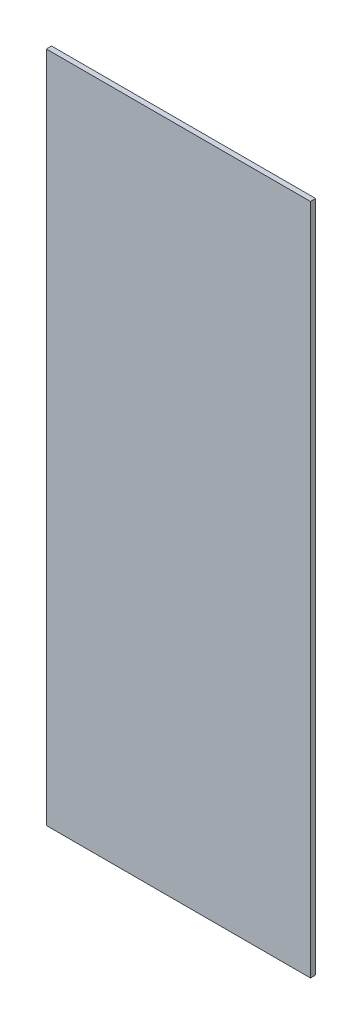
ISO-10303-21;
HEADER;
FILE_DESCRIPTION(('STEP AP214'),'2;1');
FILE_NAME('part.step','',(''),(''),'','','');
FILE_SCHEMA(('AUTOMOTIVE_DESIGN { 1 0 10303 214 1 1 1 1 }'));
ENDSEC;
DATA;
#1=APPLICATION_CONTEXT('core data for automotive mechanical design processes');
#2=APPLICATION_PROTOCOL_DEFINITION('international standard','automotive_design',2000,#1);
#3=PRODUCT_CONTEXT('',#1,'mechanical');
#4=PRODUCT('Part','Part','',(#3));
#5=PRODUCT_RELATED_PRODUCT_CATEGORY('part','',(#4));
#6=PRODUCT_DEFINITION_FORMATION('','',#4);
#7=PRODUCT_DEFINITION_CONTEXT('part definition',#1,'design');
#8=PRODUCT_DEFINITION('design','',#6,#7);
#9=PRODUCT_DEFINITION_SHAPE('','',#8);
#10=(LENGTH_UNIT() NAMED_UNIT(*) SI_UNIT(.MILLI.,.METRE.));
#11=(NAMED_UNIT(*) PLANE_ANGLE_UNIT() SI_UNIT($,.RADIAN.));
#12=(NAMED_UNIT(*) SI_UNIT($,.STERADIAN.) SOLID_ANGLE_UNIT());
#13=UNCERTAINTY_MEASURE_WITH_UNIT(LENGTH_MEASURE(1.E-05),#10,'distance_accuracy_value','');
#14=(GEOMETRIC_REPRESENTATION_CONTEXT(3) GLOBAL_UNCERTAINTY_ASSIGNED_CONTEXT((#13)) GLOBAL_UNIT_ASSIGNED_CONTEXT((#10,
#11,#12)) REPRESENTATION_CONTEXT('',''));
#15=CARTESIAN_POINT('',(0.,0.,0.));
#16=DIRECTION('',(0.,0.,1.));
#17=DIRECTION('',(1.,0.,0.));
#18=AXIS2_PLACEMENT_3D('',#15,#16,#17);
#19=CARTESIAN_POINT('',(324.,-825.,12.7));
#20=DIRECTION('',(-1.,0.,0.));
#21=DIRECTION('',(0.,0.,1.));
#22=AXIS2_PLACEMENT_3D('',#19,#20,#21);
#23=PLANE('',#22);
#24=DIRECTION('',(0.,1.,0.));
#25=VECTOR('',#24,1.);
#26=CARTESIAN_POINT('',(324.,-825.,0.));
#27=LINE('',#26,#25);
#28=CARTESIAN_POINT('',(324.,-825.,0.));
#29=VERTEX_POINT('',#28);
#30=CARTESIAN_POINT('',(324.,825.,0.));
#31=VERTEX_POINT('',#30);
#32=EDGE_CURVE('E107',#29,#31,#27,.T.);
#33=ORIENTED_EDGE('',*,*,#32,.T.);
#34=DIRECTION('',(0.,0.,-1.));
#35=VECTOR('',#34,1.);
#36=CARTESIAN_POINT('',(324.,825.,12.7));
#37=LINE('',#36,#35);
#38=CARTESIAN_POINT('',(324.,825.,12.7));
#39=VERTEX_POINT('',#38);
#40=EDGE_CURVE('E11',#39,#31,#37,.T.);
#41=ORIENTED_EDGE('',*,*,#40,.F.);
#42=DIRECTION('',(0.,1.,0.));
#43=VECTOR('',#42,1.);
#44=CARTESIAN_POINT('',(324.,-825.,12.7));
#45=LINE('',#44,#43);
#46=CARTESIAN_POINT('',(324.,-825.,12.7));
#47=VERTEX_POINT('',#46);
#48=EDGE_CURVE('E91',#47,#39,#45,.T.);
#49=ORIENTED_EDGE('',*,*,#48,.F.);
#50=DIRECTION('',(0.,0.,-1.));
#51=VECTOR('',#50,1.);
#52=CARTESIAN_POINT('',(324.,-825.,12.7));
#53=LINE('',#52,#51);
#54=EDGE_CURVE('E103',#47,#29,#53,.T.);
#55=ORIENTED_EDGE('',*,*,#54,.T.);
#56=EDGE_LOOP('',(#33,#41,#49,#55));
#57=FACE_BOUND('',#56,.T.);
#58=ADVANCED_FACE('F39',(#57),#23,.F.);
#59=CARTESIAN_POINT('',(-324.,825.,12.7));
#60=DIRECTION('',(0.,-1.,0.));
#61=DIRECTION('',(0.,0.,-1.));
#62=AXIS2_PLACEMENT_3D('',#59,#60,#61);
#63=PLANE('',#62);
#64=DIRECTION('',(-1.,0.,0.));
#65=VECTOR('',#64,1.);
#66=CARTESIAN_POINT('',(-324.,825.,0.));
#67=LINE('',#66,#65);
#68=CARTESIAN_POINT('',(-324.,825.,0.));
#69=VERTEX_POINT('',#68);
#70=EDGE_CURVE('E96',#31,#69,#67,.T.);
#71=ORIENTED_EDGE('',*,*,#70,.T.);
#72=DIRECTION('',(0.,0.,-1.));
#73=VECTOR('',#72,1.);
#74=CARTESIAN_POINT('',(-324.,825.,12.7));
#75=LINE('',#74,#73);
#76=CARTESIAN_POINT('',(-324.,825.,12.7));
#77=VERTEX_POINT('',#76);
#78=EDGE_CURVE('E48',#77,#69,#75,.T.);
#79=ORIENTED_EDGE('',*,*,#78,.F.);
#80=DIRECTION('',(-1.,0.,0.));
#81=VECTOR('',#80,1.);
#82=CARTESIAN_POINT('',(-324.,825.,12.7));
#83=LINE('',#82,#81);
#84=EDGE_CURVE('E86',#39,#77,#83,.T.);
#85=ORIENTED_EDGE('',*,*,#84,.F.);
#86=ORIENTED_EDGE('',*,*,#40,.T.);
#87=EDGE_LOOP('',(#71,#79,#85,#86));
#88=FACE_BOUND('',#87,.T.);
#89=ADVANCED_FACE('F95',(#88),#63,.F.);
#90=CARTESIAN_POINT('',(-324.,-825.,12.7));
#91=DIRECTION('',(1.,0.,0.));
#92=DIRECTION('',(0.,0.,-1.));
#93=AXIS2_PLACEMENT_3D('',#90,#91,#92);
#94=PLANE('',#93);
#95=DIRECTION('',(0.,-1.,0.));
#96=VECTOR('',#95,1.);
#97=CARTESIAN_POINT('',(-324.,-825.,0.));
#98=LINE('',#97,#96);
#99=CARTESIAN_POINT('',(-324.,-825.,0.));
#100=VERTEX_POINT('',#99);
#101=EDGE_CURVE('E73',#69,#100,#98,.T.);
#102=ORIENTED_EDGE('',*,*,#101,.T.);
#103=DIRECTION('',(0.,0.,-1.));
#104=VECTOR('',#103,1.);
#105=CARTESIAN_POINT('',(-324.,-825.,12.7));
#106=LINE('',#105,#104);
#107=CARTESIAN_POINT('',(-324.,-825.,12.7));
#108=VERTEX_POINT('',#107);
#109=EDGE_CURVE('E98',#108,#100,#106,.T.);
#110=ORIENTED_EDGE('',*,*,#109,.F.);
#111=DIRECTION('',(0.,-1.,0.));
#112=VECTOR('',#111,1.);
#113=CARTESIAN_POINT('',(-324.,-825.,12.7));
#114=LINE('',#113,#112);
#115=EDGE_CURVE('E89',#77,#108,#114,.T.);
#116=ORIENTED_EDGE('',*,*,#115,.F.);
#117=ORIENTED_EDGE('',*,*,#78,.T.);
#118=EDGE_LOOP('',(#102,#110,#116,#117));
#119=FACE_BOUND('',#118,.T.);
#120=ADVANCED_FACE('F99',(#119),#94,.F.);
#121=CARTESIAN_POINT('',(-324.,-825.,12.7));
#122=DIRECTION('',(0.,1.,0.));
#123=DIRECTION('',(0.,0.,1.));
#124=AXIS2_PLACEMENT_3D('',#121,#122,#123);
#125=PLANE('',#124);
#126=DIRECTION('',(1.,0.,0.));
#127=VECTOR('',#126,1.);
#128=CARTESIAN_POINT('',(-324.,-825.,0.));
#129=LINE('',#128,#127);
#130=EDGE_CURVE('E79',#100,#29,#129,.T.);
#131=ORIENTED_EDGE('',*,*,#130,.T.);
#132=ORIENTED_EDGE('',*,*,#54,.F.);
#133=DIRECTION('',(1.,0.,0.));
#134=VECTOR('',#133,1.);
#135=CARTESIAN_POINT('',(-324.,-825.,12.7));
#136=LINE('',#135,#134);
#137=EDGE_CURVE('E56',#108,#47,#136,.T.);
#138=ORIENTED_EDGE('',*,*,#137,.F.);
#139=ORIENTED_EDGE('',*,*,#109,.T.);
#140=EDGE_LOOP('',(#131,#132,#138,#139));
#141=FACE_BOUND('',#140,.T.);
#142=ADVANCED_FACE('F120',(#141),#125,.F.);
#143=CARTESIAN_POINT('',(0.,0.,12.7));
#144=DIRECTION('',(0.,0.,-1.));
#145=DIRECTION('',(-1.,0.,0.));
#146=AXIS2_PLACEMENT_3D('',#143,#144,#145);
#147=PLANE('',#146);
#148=ORIENTED_EDGE('',*,*,#48,.T.);
#149=ORIENTED_EDGE('',*,*,#84,.T.);
#150=ORIENTED_EDGE('',*,*,#115,.T.);
#151=ORIENTED_EDGE('',*,*,#137,.T.);
#152=EDGE_LOOP('',(#148,#149,#150,#151));
#153=FACE_BOUND('',#152,.T.);
#154=ADVANCED_FACE('F87',(#153),#147,.F.);
#155=CARTESIAN_POINT('',(0.,0.,0.));
#156=DIRECTION('',(0.,0.,-1.));
#157=DIRECTION('',(-1.,0.,0.));
#158=AXIS2_PLACEMENT_3D('',#155,#156,#157);
#159=PLANE('',#158);
#160=ORIENTED_EDGE('',*,*,#32,.F.);
#161=ORIENTED_EDGE('',*,*,#130,.F.);
#162=ORIENTED_EDGE('',*,*,#101,.F.);
#163=ORIENTED_EDGE('',*,*,#70,.F.);
#164=EDGE_LOOP('',(#160,#161,#162,#163));
#165=FACE_BOUND('',#164,.T.);
#166=ADVANCED_FACE('F123',(#165),#159,.T.);
#167=CLOSED_SHELL('',(#58,#89,#120,#142,#154,#166));
#168=MANIFOLD_SOLID_BREP('B2',#167);
#169=ADVANCED_BREP_SHAPE_REPRESENTATION('',(#18,#168),#14);
#170=SHAPE_DEFINITION_REPRESENTATION(#9,#169);
ENDSEC;
END-ISO-10303-21;
